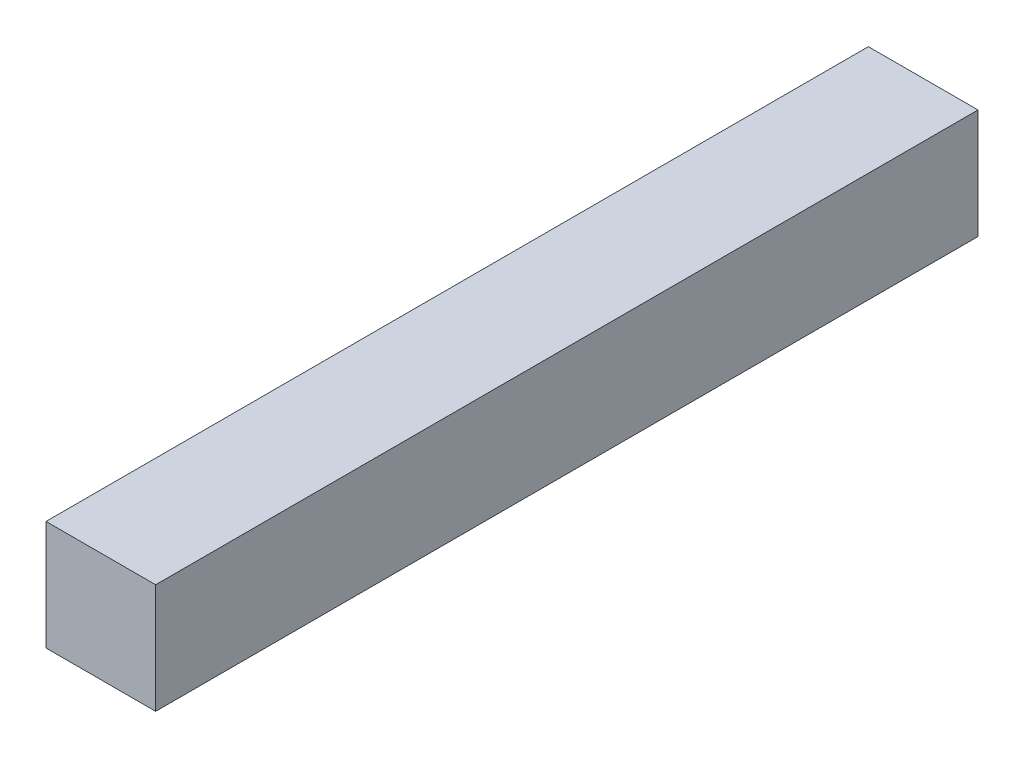
ISO-10303-21;
HEADER;
FILE_DESCRIPTION(('STEP AP214'),'2;1');
FILE_NAME('part.step','',(''),(''),'','','');
FILE_SCHEMA(('AUTOMOTIVE_DESIGN { 1 0 10303 214 1 1 1 1 }'));
ENDSEC;
DATA;
#1=APPLICATION_CONTEXT('core data for automotive mechanical design processes');
#2=APPLICATION_PROTOCOL_DEFINITION('international standard','automotive_design',2000,#1);
#3=PRODUCT_CONTEXT('',#1,'mechanical');
#4=PRODUCT('Part','Part','',(#3));
#5=PRODUCT_RELATED_PRODUCT_CATEGORY('part','',(#4));
#6=PRODUCT_DEFINITION_FORMATION('','',#4);
#7=PRODUCT_DEFINITION_CONTEXT('part definition',#1,'design');
#8=PRODUCT_DEFINITION('design','',#6,#7);
#9=PRODUCT_DEFINITION_SHAPE('','',#8);
#10=(LENGTH_UNIT() NAMED_UNIT(*) SI_UNIT(.MILLI.,.METRE.));
#11=(NAMED_UNIT(*) PLANE_ANGLE_UNIT() SI_UNIT($,.RADIAN.));
#12=(NAMED_UNIT(*) SI_UNIT($,.STERADIAN.) SOLID_ANGLE_UNIT());
#13=UNCERTAINTY_MEASURE_WITH_UNIT(LENGTH_MEASURE(1.E-05),#10,'distance_accuracy_value','');
#14=(GEOMETRIC_REPRESENTATION_CONTEXT(3) GLOBAL_UNCERTAINTY_ASSIGNED_CONTEXT((#13)) GLOBAL_UNIT_ASSIGNED_CONTEXT((#10,
#11,#12)) REPRESENTATION_CONTEXT('',''));
#15=CARTESIAN_POINT('',(0.,0.,0.));
#16=DIRECTION('',(0.,0.,1.));
#17=DIRECTION('',(1.,0.,0.));
#18=AXIS2_PLACEMENT_3D('',#15,#16,#17);
#19=CARTESIAN_POINT('',(-16.9667759319962,40.,-13.2926829268293));
#20=DIRECTION('',(1.,0.,0.));
#21=DIRECTION('',(0.,0.,-1.));
#22=AXIS2_PLACEMENT_3D('',#19,#20,#21);
#23=PLANE('',#22);
#24=DIRECTION('',(0.,0.,1.));
#25=VECTOR('',#24,1.);
#26=CARTESIAN_POINT('',(-16.9667759319962,0.,-13.2926829268293));
#27=LINE('',#26,#25);
#28=CARTESIAN_POINT('',(-16.9667759319962,0.,-13.2926829268293));
#29=VERTEX_POINT('',#28);
#30=CARTESIAN_POINT('',(-16.9667759319962,0.,286.707317073171));
#31=VERTEX_POINT('',#30);
#32=EDGE_CURVE('E98',#29,#31,#27,.T.);
#33=ORIENTED_EDGE('',*,*,#32,.T.);
#34=DIRECTION('',(0.,-1.,0.));
#35=VECTOR('',#34,1.);
#36=CARTESIAN_POINT('',(-16.9667759319962,40.,286.707317073171));
#37=LINE('',#36,#35);
#38=CARTESIAN_POINT('',(-16.9667759319962,40.,286.707317073171));
#39=VERTEX_POINT('',#38);
#40=EDGE_CURVE('E11',#39,#31,#37,.T.);
#41=ORIENTED_EDGE('',*,*,#40,.F.);
#42=DIRECTION('',(0.,0.,1.));
#43=VECTOR('',#42,1.);
#44=CARTESIAN_POINT('',(-16.9667759319962,40.,-13.2926829268293));
#45=LINE('',#44,#43);
#46=CARTESIAN_POINT('',(-16.9667759319962,40.,-13.2926829268293));
#47=VERTEX_POINT('',#46);
#48=EDGE_CURVE('E86',#47,#39,#45,.T.);
#49=ORIENTED_EDGE('',*,*,#48,.F.);
#50=DIRECTION('',(0.,-1.,0.));
#51=VECTOR('',#50,1.);
#52=CARTESIAN_POINT('',(-16.9667759319962,40.,-13.2926829268293));
#53=LINE('',#52,#51);
#54=EDGE_CURVE('E94',#47,#29,#53,.T.);
#55=ORIENTED_EDGE('',*,*,#54,.T.);
#56=EDGE_LOOP('',(#33,#41,#49,#55));
#57=FACE_BOUND('',#56,.T.);
#58=ADVANCED_FACE('F35',(#57),#23,.F.);
#59=CARTESIAN_POINT('',(-16.9667759319962,40.,286.707317073171));
#60=DIRECTION('',(0.,0.,-1.));
#61=DIRECTION('',(-1.,0.,0.));
#62=AXIS2_PLACEMENT_3D('',#59,#60,#61);
#63=PLANE('',#62);
#64=DIRECTION('',(1.,0.,0.));
#65=VECTOR('',#64,1.);
#66=CARTESIAN_POINT('',(-16.9667759319962,0.,286.707317073171));
#67=LINE('',#66,#65);
#68=CARTESIAN_POINT('',(23.0332240680038,0.,286.707317073171));
#69=VERTEX_POINT('',#68);
#70=EDGE_CURVE('E90',#31,#69,#67,.T.);
#71=ORIENTED_EDGE('',*,*,#70,.T.);
#72=DIRECTION('',(0.,-1.,0.));
#73=VECTOR('',#72,1.);
#74=CARTESIAN_POINT('',(23.0332240680038,40.,286.707317073171));
#75=LINE('',#74,#73);
#76=CARTESIAN_POINT('',(23.0332240680038,40.,286.707317073171));
#77=VERTEX_POINT('',#76);
#78=EDGE_CURVE('E43',#77,#69,#75,.T.);
#79=ORIENTED_EDGE('',*,*,#78,.F.);
#80=DIRECTION('',(1.,0.,0.));
#81=VECTOR('',#80,1.);
#82=CARTESIAN_POINT('',(-16.9667759319962,40.,286.707317073171));
#83=LINE('',#82,#81);
#84=EDGE_CURVE('E81',#39,#77,#83,.T.);
#85=ORIENTED_EDGE('',*,*,#84,.F.);
#86=ORIENTED_EDGE('',*,*,#40,.T.);
#87=EDGE_LOOP('',(#71,#79,#85,#86));
#88=FACE_BOUND('',#87,.T.);
#89=ADVANCED_FACE('F89',(#88),#63,.F.);
#90=CARTESIAN_POINT('',(23.0332240680038,40.,-13.2926829268293));
#91=DIRECTION('',(-1.,0.,0.));
#92=DIRECTION('',(0.,0.,1.));
#93=AXIS2_PLACEMENT_3D('',#90,#91,#92);
#94=PLANE('',#93);
#95=DIRECTION('',(0.,0.,-1.));
#96=VECTOR('',#95,1.);
#97=CARTESIAN_POINT('',(23.0332240680038,0.,-13.2926829268293));
#98=LINE('',#97,#96);
#99=CARTESIAN_POINT('',(23.0332240680038,0.,-13.2926829268293));
#100=VERTEX_POINT('',#99);
#101=EDGE_CURVE('E68',#69,#100,#98,.T.);
#102=ORIENTED_EDGE('',*,*,#101,.T.);
#103=DIRECTION('',(0.,-1.,0.));
#104=VECTOR('',#103,1.);
#105=CARTESIAN_POINT('',(23.0332240680038,40.,-13.2926829268293));
#106=LINE('',#105,#104);
#107=CARTESIAN_POINT('',(23.0332240680038,40.,-13.2926829268293));
#108=VERTEX_POINT('',#107);
#109=EDGE_CURVE('E91',#108,#100,#106,.T.);
#110=ORIENTED_EDGE('',*,*,#109,.F.);
#111=DIRECTION('',(0.,0.,-1.));
#112=VECTOR('',#111,1.);
#113=CARTESIAN_POINT('',(23.0332240680038,40.,-13.2926829268293));
#114=LINE('',#113,#112);
#115=EDGE_CURVE('E84',#77,#108,#114,.T.);
#116=ORIENTED_EDGE('',*,*,#115,.F.);
#117=ORIENTED_EDGE('',*,*,#78,.T.);
#118=EDGE_LOOP('',(#102,#110,#116,#117));
#119=FACE_BOUND('',#118,.T.);
#120=ADVANCED_FACE('F92',(#119),#94,.F.);
#121=CARTESIAN_POINT('',(-16.9667759319962,40.,-13.2926829268293));
#122=DIRECTION('',(0.,0.,1.));
#123=DIRECTION('',(1.,0.,0.));
#124=AXIS2_PLACEMENT_3D('',#121,#122,#123);
#125=PLANE('',#124);
#126=DIRECTION('',(-1.,0.,0.));
#127=VECTOR('',#126,1.);
#128=CARTESIAN_POINT('',(-16.9667759319962,0.,-13.2926829268293));
#129=LINE('',#128,#127);
#130=EDGE_CURVE('E74',#100,#29,#129,.T.);
#131=ORIENTED_EDGE('',*,*,#130,.T.);
#132=ORIENTED_EDGE('',*,*,#54,.F.);
#133=DIRECTION('',(-1.,0.,0.));
#134=VECTOR('',#133,1.);
#135=CARTESIAN_POINT('',(-16.9667759319962,40.,-13.2926829268293));
#136=LINE('',#135,#134);
#137=EDGE_CURVE('E51',#108,#47,#136,.T.);
#138=ORIENTED_EDGE('',*,*,#137,.F.);
#139=ORIENTED_EDGE('',*,*,#109,.T.);
#140=EDGE_LOOP('',(#131,#132,#138,#139));
#141=FACE_BOUND('',#140,.T.);
#142=ADVANCED_FACE('F105',(#141),#125,.F.);
#143=CARTESIAN_POINT('',(0.,40.,0.));
#144=DIRECTION('',(0.,1.,0.));
#145=DIRECTION('',(0.,0.,1.));
#146=AXIS2_PLACEMENT_3D('',#143,#144,#145);
#147=PLANE('',#146);
#148=ORIENTED_EDGE('',*,*,#48,.T.);
#149=ORIENTED_EDGE('',*,*,#84,.T.);
#150=ORIENTED_EDGE('',*,*,#115,.T.);
#151=ORIENTED_EDGE('',*,*,#137,.T.);
#152=EDGE_LOOP('',(#148,#149,#150,#151));
#153=FACE_BOUND('',#152,.T.);
#154=ADVANCED_FACE('F82',(#153),#147,.T.);
#155=CARTESIAN_POINT('',(0.,0.,0.));
#156=DIRECTION('',(0.,1.,0.));
#157=DIRECTION('',(0.,0.,1.));
#158=AXIS2_PLACEMENT_3D('',#155,#156,#157);
#159=PLANE('',#158);
#160=ORIENTED_EDGE('',*,*,#32,.F.);
#161=ORIENTED_EDGE('',*,*,#130,.F.);
#162=ORIENTED_EDGE('',*,*,#101,.F.);
#163=ORIENTED_EDGE('',*,*,#70,.F.);
#164=EDGE_LOOP('',(#160,#161,#162,#163));
#165=FACE_BOUND('',#164,.T.);
#166=ADVANCED_FACE('F108',(#165),#159,.F.);
#167=CLOSED_SHELL('',(#58,#89,#120,#142,#154,#166));
#168=MANIFOLD_SOLID_BREP('B2',#167);
#169=ADVANCED_BREP_SHAPE_REPRESENTATION('',(#18,#168),#14);
#170=SHAPE_DEFINITION_REPRESENTATION(#9,#169);
ENDSEC;
END-ISO-10303-21;
